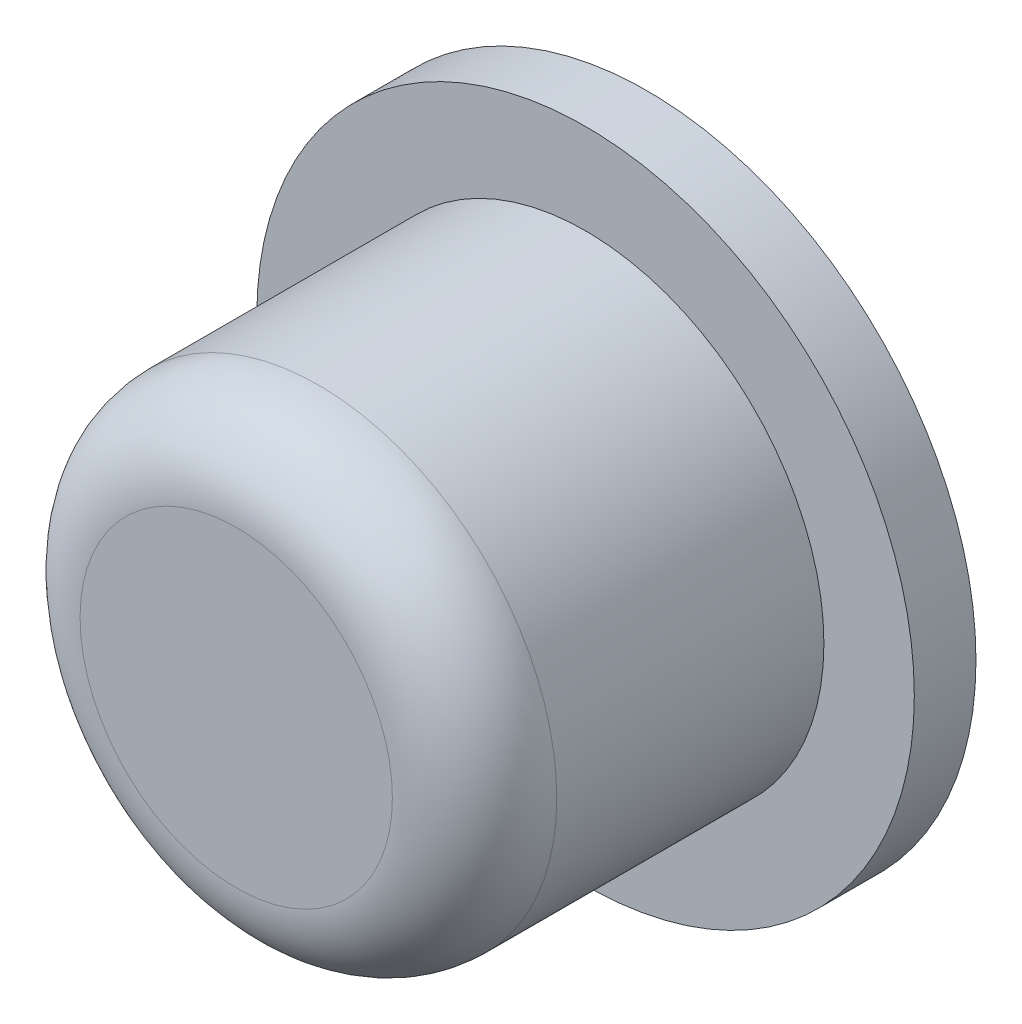
ISO-10303-21;
HEADER;
FILE_DESCRIPTION(('STEP AP214'),'2;1');
FILE_NAME('part.step','',(''),(''),'','','');
FILE_SCHEMA(('AUTOMOTIVE_DESIGN { 1 0 10303 214 1 1 1 1 }'));
ENDSEC;
DATA;
#1=APPLICATION_CONTEXT('core data for automotive mechanical design processes');
#2=APPLICATION_PROTOCOL_DEFINITION('international standard','automotive_design',2000,#1);
#3=PRODUCT_CONTEXT('',#1,'mechanical');
#4=PRODUCT('Part','Part','',(#3));
#5=PRODUCT_RELATED_PRODUCT_CATEGORY('part','',(#4));
#6=PRODUCT_DEFINITION_FORMATION('','',#4);
#7=PRODUCT_DEFINITION_CONTEXT('part definition',#1,'design');
#8=PRODUCT_DEFINITION('design','',#6,#7);
#9=PRODUCT_DEFINITION_SHAPE('','',#8);
#10=(LENGTH_UNIT() NAMED_UNIT(*) SI_UNIT(.MILLI.,.METRE.));
#11=(NAMED_UNIT(*) PLANE_ANGLE_UNIT() SI_UNIT($,.RADIAN.));
#12=(NAMED_UNIT(*) SI_UNIT($,.STERADIAN.) SOLID_ANGLE_UNIT());
#13=UNCERTAINTY_MEASURE_WITH_UNIT(LENGTH_MEASURE(1.E-05),#10,'distance_accuracy_value','');
#14=(GEOMETRIC_REPRESENTATION_CONTEXT(3) GLOBAL_UNCERTAINTY_ASSIGNED_CONTEXT((#13)) GLOBAL_UNIT_ASSIGNED_CONTEXT((#10,
#11,#12)) REPRESENTATION_CONTEXT('',''));
#15=CARTESIAN_POINT('',(0.,0.,0.));
#16=DIRECTION('',(0.,0.,1.));
#17=DIRECTION('',(1.,0.,0.));
#18=AXIS2_PLACEMENT_3D('',#15,#16,#17);
#19=CARTESIAN_POINT('',(0.,0.,0.75));
#20=DIRECTION('',(0.,0.,-1.));
#21=DIRECTION('',(-1.,0.,0.));
#22=AXIS2_PLACEMENT_3D('',#19,#20,#21);
#23=CYLINDRICAL_SURFACE('',#22,4.);
#24=CARTESIAN_POINT('',(0.,0.,0.75));
#25=DIRECTION('',(0.,0.,1.));
#26=DIRECTION('',(1.,0.,0.));
#27=AXIS2_PLACEMENT_3D('',#24,#25,#26);
#28=CIRCLE('',#27,4.);
#29=CARTESIAN_POINT('',(4.,0.,0.75));
#30=VERTEX_POINT('',#29);
#31=EDGE_CURVE('E113',#30,#30,#28,.T.);
#32=ORIENTED_EDGE('',*,*,#31,.F.);
#33=EDGE_LOOP('',(#32));
#34=FACE_BOUND('',#33,.T.);
#35=CARTESIAN_POINT('',(0.,0.,0.));
#36=DIRECTION('',(0.,0.,1.));
#37=DIRECTION('',(1.,0.,0.));
#38=AXIS2_PLACEMENT_3D('',#35,#36,#37);
#39=CIRCLE('',#38,4.);
#40=CARTESIAN_POINT('',(4.,0.,0.));
#41=VERTEX_POINT('',#40);
#42=EDGE_CURVE('E112',#41,#41,#39,.T.);
#43=ORIENTED_EDGE('',*,*,#42,.T.);
#44=EDGE_LOOP('',(#43));
#45=FACE_BOUND('',#44,.T.);
#46=ADVANCED_FACE('F33',(#34,#45),#23,.T.);
#47=CARTESIAN_POINT('',(0.,0.,0.75));
#48=DIRECTION('',(0.,0.,1.));
#49=DIRECTION('',(1.,0.,0.));
#50=AXIS2_PLACEMENT_3D('',#47,#48,#49);
#51=PLANE('',#50);
#52=CARTESIAN_POINT('',(0.,0.,0.75));
#53=DIRECTION('',(0.,0.,1.));
#54=DIRECTION('',(1.,0.,0.));
#55=AXIS2_PLACEMENT_3D('',#52,#53,#54);
#56=CIRCLE('',#55,2.9);
#57=CARTESIAN_POINT('',(2.9,0.,0.75));
#58=VERTEX_POINT('',#57);
#59=EDGE_CURVE('E108',#58,#58,#56,.T.);
#60=ORIENTED_EDGE('',*,*,#59,.F.);
#61=EDGE_LOOP('',(#60));
#62=FACE_BOUND('',#61,.T.);
#63=ORIENTED_EDGE('',*,*,#31,.T.);
#64=EDGE_LOOP('',(#63));
#65=FACE_BOUND('',#64,.T.);
#66=ADVANCED_FACE('F135',(#62,#65),#51,.T.);
#67=CARTESIAN_POINT('',(0.,0.,0.));
#68=DIRECTION('',(0.,0.,1.));
#69=DIRECTION('',(1.,0.,0.));
#70=AXIS2_PLACEMENT_3D('',#67,#68,#69);
#71=PLANE('',#70);
#72=DIRECTION('',(1.,0.,0.));
#73=VECTOR('',#72,1.);
#74=CARTESIAN_POINT('',(-1.45,1.45,0.));
#75=LINE('',#74,#73);
#76=CARTESIAN_POINT('',(-1.45,1.45,0.));
#77=VERTEX_POINT('',#76);
#78=CARTESIAN_POINT('',(1.45,1.45,0.));
#79=VERTEX_POINT('',#78);
#80=EDGE_CURVE('E90',#77,#79,#75,.T.);
#81=ORIENTED_EDGE('',*,*,#80,.F.);
#82=DIRECTION('',(0.,1.,0.));
#83=VECTOR('',#82,1.);
#84=CARTESIAN_POINT('',(-1.45,-1.45,0.));
#85=LINE('',#84,#83);
#86=CARTESIAN_POINT('',(-1.45,-1.45,0.));
#87=VERTEX_POINT('',#86);
#88=EDGE_CURVE('E48',#87,#77,#85,.T.);
#89=ORIENTED_EDGE('',*,*,#88,.F.);
#90=DIRECTION('',(-1.,0.,0.));
#91=VECTOR('',#90,1.);
#92=CARTESIAN_POINT('',(1.45,-1.45,0.));
#93=LINE('',#92,#91);
#94=CARTESIAN_POINT('',(1.45,-1.45,0.));
#95=VERTEX_POINT('',#94);
#96=EDGE_CURVE('E97',#95,#87,#93,.T.);
#97=ORIENTED_EDGE('',*,*,#96,.F.);
#98=DIRECTION('',(0.,-1.,0.));
#99=VECTOR('',#98,1.);
#100=CARTESIAN_POINT('',(1.45,1.45,0.));
#101=LINE('',#100,#99);
#102=EDGE_CURVE('E81',#79,#95,#101,.T.);
#103=ORIENTED_EDGE('',*,*,#102,.F.);
#104=EDGE_LOOP('',(#81,#89,#97,#103));
#105=FACE_BOUND('',#104,.T.);
#106=ORIENTED_EDGE('',*,*,#42,.F.);
#107=EDGE_LOOP('',(#106));
#108=FACE_BOUND('',#107,.T.);
#109=ADVANCED_FACE('F94',(#105,#108),#71,.F.);
#110=CARTESIAN_POINT('',(0.,0.,5.));
#111=DIRECTION('',(0.,0.,-1.));
#112=DIRECTION('',(-1.,0.,0.));
#113=AXIS2_PLACEMENT_3D('',#110,#111,#112);
#114=CYLINDRICAL_SURFACE('',#113,2.9);
#115=CARTESIAN_POINT('',(0.,0.,4.));
#116=DIRECTION('',(0.,0.,1.));
#117=DIRECTION('',(1.,0.,0.));
#118=AXIS2_PLACEMENT_3D('',#115,#116,#117);
#119=CIRCLE('',#118,2.9);
#120=CARTESIAN_POINT('',(2.9,0.,4.));
#121=VERTEX_POINT('',#120);
#122=EDGE_CURVE('E11',#121,#121,#119,.F.);
#123=ORIENTED_EDGE('',*,*,#122,.T.);
#124=EDGE_LOOP('',(#123));
#125=FACE_BOUND('',#124,.T.);
#126=ORIENTED_EDGE('',*,*,#59,.T.);
#127=EDGE_LOOP('',(#126));
#128=FACE_BOUND('',#127,.T.);
#129=ADVANCED_FACE('F131',(#125,#128),#114,.T.);
#130=CARTESIAN_POINT('',(0.,0.,5.));
#131=DIRECTION('',(0.,0.,1.));
#132=DIRECTION('',(1.,0.,0.));
#133=AXIS2_PLACEMENT_3D('',#130,#131,#132);
#134=PLANE('',#133);
#135=CARTESIAN_POINT('',(0.,0.,5.));
#136=DIRECTION('',(0.,0.,1.));
#137=DIRECTION('',(1.,0.,0.));
#138=AXIS2_PLACEMENT_3D('',#135,#136,#137);
#139=CIRCLE('',#138,1.9);
#140=CARTESIAN_POINT('',(1.9,0.,5.));
#141=VERTEX_POINT('',#140);
#142=EDGE_CURVE('E41',#141,#141,#139,.T.);
#143=ORIENTED_EDGE('',*,*,#142,.T.);
#144=EDGE_LOOP('',(#143));
#145=FACE_BOUND('',#144,.T.);
#146=ADVANCED_FACE('F120',(#145),#134,.T.);
#147=CARTESIAN_POINT('',(0.,0.,4.));
#148=DIRECTION('',(0.,0.,1.));
#149=DIRECTION('',(1.,0.,0.));
#150=AXIS2_PLACEMENT_3D('',#147,#148,#149);
#151=TOROIDAL_SURFACE('',#150,1.9,1.);
#152=ORIENTED_EDGE('',*,*,#122,.F.);
#153=EDGE_LOOP('',(#152));
#154=FACE_BOUND('',#153,.T.);
#155=ORIENTED_EDGE('',*,*,#142,.F.);
#156=EDGE_LOOP('',(#155));
#157=FACE_BOUND('',#156,.T.);
#158=ADVANCED_FACE('F35',(#154,#157),#151,.T.);
#159=CARTESIAN_POINT('',(-1.45,-1.45,5.10121933088198));
#160=DIRECTION('',(-1.,0.,0.));
#161=DIRECTION('',(0.,-1.,0.));
#162=AXIS2_PLACEMENT_3D('',#159,#160,#161);
#163=PLANE('',#162);
#164=DIRECTION('',(0.,-1.,0.));
#165=VECTOR('',#164,1.);
#166=CARTESIAN_POINT('',(-1.45,-1.45,1.));
#167=LINE('',#166,#165);
#168=CARTESIAN_POINT('',(-1.45,1.45,1.));
#169=VERTEX_POINT('',#168);
#170=CARTESIAN_POINT('',(-1.45,-1.45,1.));
#171=VERTEX_POINT('',#170);
#172=EDGE_CURVE('E109',#169,#171,#167,.T.);
#173=ORIENTED_EDGE('',*,*,#172,.T.);
#174=DIRECTION('',(0.,0.,-1.));
#175=VECTOR('',#174,1.);
#176=CARTESIAN_POINT('',(-1.45,-1.45,5.10121933088198));
#177=LINE('',#176,#175);
#178=EDGE_CURVE('E102',#171,#87,#177,.T.);
#179=ORIENTED_EDGE('',*,*,#178,.T.);
#180=ORIENTED_EDGE('',*,*,#88,.T.);
#181=DIRECTION('',(0.,0.,-1.));
#182=VECTOR('',#181,1.);
#183=CARTESIAN_POINT('',(-1.45,1.45,5.10121933088198));
#184=LINE('',#183,#182);
#185=EDGE_CURVE('E87',#169,#77,#184,.T.);
#186=ORIENTED_EDGE('',*,*,#185,.F.);
#187=EDGE_LOOP('',(#173,#179,#180,#186));
#188=FACE_BOUND('',#187,.T.);
#189=ADVANCED_FACE('F123',(#188),#163,.F.);
#190=CARTESIAN_POINT('',(1.45,-1.45,5.10121933088198));
#191=DIRECTION('',(0.,-1.,0.));
#192=DIRECTION('',(0.,0.,-1.));
#193=AXIS2_PLACEMENT_3D('',#190,#191,#192);
#194=PLANE('',#193);
#195=DIRECTION('',(1.,0.,0.));
#196=VECTOR('',#195,1.);
#197=CARTESIAN_POINT('',(1.45,-1.45,1.));
#198=LINE('',#197,#196);
#199=CARTESIAN_POINT('',(1.45,-1.45,1.));
#200=VERTEX_POINT('',#199);
#201=EDGE_CURVE('E57',#171,#200,#198,.T.);
#202=ORIENTED_EDGE('',*,*,#201,.T.);
#203=DIRECTION('',(0.,0.,-1.));
#204=VECTOR('',#203,1.);
#205=CARTESIAN_POINT('',(1.45,-1.45,5.10121933088198));
#206=LINE('',#205,#204);
#207=EDGE_CURVE('E86',#200,#95,#206,.T.);
#208=ORIENTED_EDGE('',*,*,#207,.T.);
#209=ORIENTED_EDGE('',*,*,#96,.T.);
#210=ORIENTED_EDGE('',*,*,#178,.F.);
#211=EDGE_LOOP('',(#202,#208,#209,#210));
#212=FACE_BOUND('',#211,.T.);
#213=ADVANCED_FACE('F129',(#212),#194,.F.);
#214=CARTESIAN_POINT('',(1.45,1.45,5.10121933088198));
#215=DIRECTION('',(1.,0.,0.));
#216=DIRECTION('',(0.,1.,0.));
#217=AXIS2_PLACEMENT_3D('',#214,#215,#216);
#218=PLANE('',#217);
#219=DIRECTION('',(0.,1.,0.));
#220=VECTOR('',#219,1.);
#221=CARTESIAN_POINT('',(1.45,1.45,1.));
#222=LINE('',#221,#220);
#223=CARTESIAN_POINT('',(1.45,1.45,1.));
#224=VERTEX_POINT('',#223);
#225=EDGE_CURVE('E83',#200,#224,#222,.T.);
#226=ORIENTED_EDGE('',*,*,#225,.T.);
#227=DIRECTION('',(0.,0.,-1.));
#228=VECTOR('',#227,1.);
#229=CARTESIAN_POINT('',(1.45,1.45,5.10121933088198));
#230=LINE('',#229,#228);
#231=EDGE_CURVE('E76',#224,#79,#230,.T.);
#232=ORIENTED_EDGE('',*,*,#231,.T.);
#233=ORIENTED_EDGE('',*,*,#102,.T.);
#234=ORIENTED_EDGE('',*,*,#207,.F.);
#235=EDGE_LOOP('',(#226,#232,#233,#234));
#236=FACE_BOUND('',#235,.T.);
#237=ADVANCED_FACE('F78',(#236),#218,.F.);
#238=CARTESIAN_POINT('',(-1.45,1.45,5.10121933088198));
#239=DIRECTION('',(0.,1.,0.));
#240=DIRECTION('',(0.,0.,1.));
#241=AXIS2_PLACEMENT_3D('',#238,#239,#240);
#242=PLANE('',#241);
#243=DIRECTION('',(-1.,0.,0.));
#244=VECTOR('',#243,1.);
#245=CARTESIAN_POINT('',(-1.45,1.45,1.));
#246=LINE('',#245,#244);
#247=EDGE_CURVE('E106',#224,#169,#246,.T.);
#248=ORIENTED_EDGE('',*,*,#247,.T.);
#249=ORIENTED_EDGE('',*,*,#185,.T.);
#250=ORIENTED_EDGE('',*,*,#80,.T.);
#251=ORIENTED_EDGE('',*,*,#231,.F.);
#252=EDGE_LOOP('',(#248,#249,#250,#251));
#253=FACE_BOUND('',#252,.T.);
#254=ADVANCED_FACE('F91',(#253),#242,.F.);
#255=CARTESIAN_POINT('',(0.,0.,1.));
#256=DIRECTION('',(0.,0.,-1.));
#257=DIRECTION('',(-1.,0.,0.));
#258=AXIS2_PLACEMENT_3D('',#255,#256,#257);
#259=PLANE('',#258);
#260=ORIENTED_EDGE('',*,*,#172,.F.);
#261=ORIENTED_EDGE('',*,*,#247,.F.);
#262=ORIENTED_EDGE('',*,*,#225,.F.);
#263=ORIENTED_EDGE('',*,*,#201,.F.);
#264=EDGE_LOOP('',(#260,#261,#262,#263));
#265=FACE_BOUND('',#264,.T.);
#266=ADVANCED_FACE('F150',(#265),#259,.T.);
#267=CLOSED_SHELL('',(#46,#66,#109,#129,#146,#158,#189,#213,#237,#254,#266));
#268=MANIFOLD_SOLID_BREP('B2',#267);
#269=ADVANCED_BREP_SHAPE_REPRESENTATION('',(#18,#268),#14);
#270=SHAPE_DEFINITION_REPRESENTATION(#9,#269);
ENDSEC;
END-ISO-10303-21;
